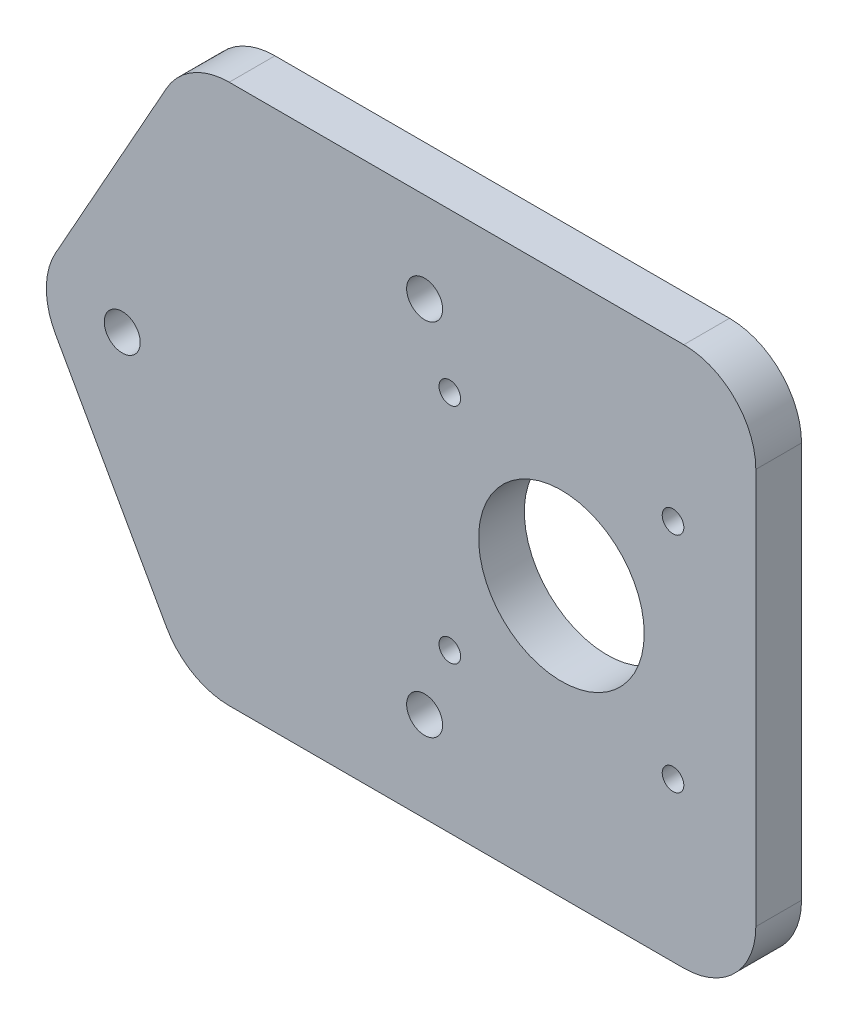
ISO-10303-21;
HEADER;
FILE_DESCRIPTION(('STEP AP214'),'2;1');
FILE_NAME('part.step','',(''),(''),'','','');
FILE_SCHEMA(('AUTOMOTIVE_DESIGN { 1 0 10303 214 1 1 1 1 }'));
ENDSEC;
DATA;
#1=APPLICATION_CONTEXT('core data for automotive mechanical design processes');
#2=APPLICATION_PROTOCOL_DEFINITION('international standard','automotive_design',2000,#1);
#3=PRODUCT_CONTEXT('',#1,'mechanical');
#4=PRODUCT('Part','Part','',(#3));
#5=PRODUCT_RELATED_PRODUCT_CATEGORY('part','',(#4));
#6=PRODUCT_DEFINITION_FORMATION('','',#4);
#7=PRODUCT_DEFINITION_CONTEXT('part definition',#1,'design');
#8=PRODUCT_DEFINITION('design','',#6,#7);
#9=PRODUCT_DEFINITION_SHAPE('','',#8);
#10=(LENGTH_UNIT() NAMED_UNIT(*) SI_UNIT(.MILLI.,.METRE.));
#11=(NAMED_UNIT(*) PLANE_ANGLE_UNIT() SI_UNIT($,.RADIAN.));
#12=(NAMED_UNIT(*) SI_UNIT($,.STERADIAN.) SOLID_ANGLE_UNIT());
#13=UNCERTAINTY_MEASURE_WITH_UNIT(LENGTH_MEASURE(1.E-05),#10,'distance_accuracy_value','');
#14=(GEOMETRIC_REPRESENTATION_CONTEXT(3) GLOBAL_UNCERTAINTY_ASSIGNED_CONTEXT((#13)) GLOBAL_UNIT_ASSIGNED_CONTEXT((#10,
#11,#12)) REPRESENTATION_CONTEXT('',''));
#15=CARTESIAN_POINT('',(0.,0.,0.));
#16=DIRECTION('',(0.,0.,1.));
#17=DIRECTION('',(1.,0.,0.));
#18=AXIS2_PLACEMENT_3D('',#15,#16,#17);
#19=CARTESIAN_POINT('',(0.,75.,6.35));
#20=DIRECTION('',(0.,-1.,0.));
#21=DIRECTION('',(0.,0.,-1.));
#22=AXIS2_PLACEMENT_3D('',#19,#20,#21);
#23=PLANE('',#22);
#24=DIRECTION('',(-1.,0.,0.));
#25=VECTOR('',#24,1.);
#26=CARTESIAN_POINT('',(0.,75.,0.));
#27=LINE('',#26,#25);
#28=CARTESIAN_POINT('',(90.,75.,0.));
#29=VERTEX_POINT('',#28);
#30=CARTESIAN_POINT('',(26.8612390255155,75.,0.));
#31=VERTEX_POINT('',#30);
#32=EDGE_CURVE('E133',#29,#31,#27,.T.);
#33=ORIENTED_EDGE('',*,*,#32,.T.);
#34=DIRECTION('',(0.,0.,1.));
#35=VECTOR('',#34,1.);
#36=CARTESIAN_POINT('',(26.8612390255155,75.,6.35));
#37=LINE('',#36,#35);
#38=CARTESIAN_POINT('',(26.8612390255155,75.,6.35));
#39=VERTEX_POINT('',#38);
#40=EDGE_CURVE('E11',#31,#39,#37,.T.);
#41=ORIENTED_EDGE('',*,*,#40,.T.);
#42=DIRECTION('',(-1.,0.,0.));
#43=VECTOR('',#42,1.);
#44=CARTESIAN_POINT('',(0.,75.,6.35));
#45=LINE('',#44,#43);
#46=CARTESIAN_POINT('',(90.,75.,6.35));
#47=VERTEX_POINT('',#46);
#48=EDGE_CURVE('E136',#47,#39,#45,.T.);
#49=ORIENTED_EDGE('',*,*,#48,.F.);
#50=DIRECTION('',(0.,0.,-1.));
#51=VECTOR('',#50,1.);
#52=CARTESIAN_POINT('',(90.,75.,6.35));
#53=LINE('',#52,#51);
#54=EDGE_CURVE('E123',#47,#29,#53,.T.);
#55=ORIENTED_EDGE('',*,*,#54,.T.);
#56=EDGE_LOOP('',(#33,#41,#49,#55));
#57=FACE_BOUND('',#56,.T.);
#58=ADVANCED_FACE('F39',(#57),#23,.F.);
#59=CARTESIAN_POINT('',(0.,0.,6.35));
#60=DIRECTION('',(0.,0.,-1.));
#61=DIRECTION('',(-1.,0.,0.));
#62=AXIS2_PLACEMENT_3D('',#59,#60,#61);
#63=PLANE('',#62);
#64=CARTESIAN_POINT('',(54.,12.5,6.35));
#65=DIRECTION('',(0.,0.,1.));
#66=DIRECTION('',(1.,0.,0.));
#67=AXIS2_PLACEMENT_3D('',#64,#65,#66);
#68=CIRCLE('',#67,2.5);
#69=CARTESIAN_POINT('',(56.5,12.5,6.35));
#70=VERTEX_POINT('',#69);
#71=EDGE_CURVE('E281',#70,#70,#68,.T.);
#72=ORIENTED_EDGE('',*,*,#71,.F.);
#73=EDGE_LOOP('',(#72));
#74=FACE_BOUND('',#73,.T.);
#75=CARTESIAN_POINT('',(12.,37.5,6.35));
#76=DIRECTION('',(0.,0.,1.));
#77=DIRECTION('',(1.,0.,0.));
#78=AXIS2_PLACEMENT_3D('',#75,#76,#77);
#79=CIRCLE('',#78,2.5);
#80=CARTESIAN_POINT('',(14.5,37.5,6.35));
#81=VERTEX_POINT('',#80);
#82=EDGE_CURVE('E294',#81,#81,#79,.T.);
#83=ORIENTED_EDGE('',*,*,#82,.F.);
#84=EDGE_LOOP('',(#83));
#85=FACE_BOUND('',#84,.T.);
#86=CARTESIAN_POINT('',(54.,62.5,6.35));
#87=DIRECTION('',(0.,0.,1.));
#88=DIRECTION('',(1.,0.,0.));
#89=AXIS2_PLACEMENT_3D('',#86,#87,#88);
#90=CIRCLE('',#89,2.5);
#91=CARTESIAN_POINT('',(56.5,62.5,6.35));
#92=VERTEX_POINT('',#91);
#93=EDGE_CURVE('E286',#92,#92,#90,.T.);
#94=ORIENTED_EDGE('',*,*,#93,.F.);
#95=EDGE_LOOP('',(#94));
#96=FACE_BOUND('',#95,.T.);
#97=CARTESIAN_POINT('',(88.5,53.,6.35));
#98=DIRECTION('',(0.,0.,1.));
#99=DIRECTION('',(1.,0.,0.));
#100=AXIS2_PLACEMENT_3D('',#97,#98,#99);
#101=CIRCLE('',#100,1.5);
#102=CARTESIAN_POINT('',(90.,53.,6.35));
#103=VERTEX_POINT('',#102);
#104=EDGE_CURVE('E274',#103,#103,#101,.T.);
#105=ORIENTED_EDGE('',*,*,#104,.F.);
#106=EDGE_LOOP('',(#105));
#107=FACE_BOUND('',#106,.T.);
#108=CARTESIAN_POINT('',(73.,37.5,6.35));
#109=DIRECTION('',(0.,0.,1.));
#110=DIRECTION('',(1.,0.,0.));
#111=AXIS2_PLACEMENT_3D('',#108,#109,#110);
#112=CIRCLE('',#111,11.5);
#113=CARTESIAN_POINT('',(84.5,37.5,6.35));
#114=VERTEX_POINT('',#113);
#115=EDGE_CURVE('E257',#114,#114,#112,.T.);
#116=ORIENTED_EDGE('',*,*,#115,.F.);
#117=EDGE_LOOP('',(#116));
#118=FACE_BOUND('',#117,.T.);
#119=CARTESIAN_POINT('',(57.5,22.,6.35));
#120=DIRECTION('',(0.,0.,1.));
#121=DIRECTION('',(1.,0.,0.));
#122=AXIS2_PLACEMENT_3D('',#119,#120,#121);
#123=CIRCLE('',#122,1.5);
#124=CARTESIAN_POINT('',(59.,22.,6.35));
#125=VERTEX_POINT('',#124);
#126=EDGE_CURVE('E258',#125,#125,#123,.T.);
#127=ORIENTED_EDGE('',*,*,#126,.F.);
#128=EDGE_LOOP('',(#127));
#129=FACE_BOUND('',#128,.T.);
#130=CARTESIAN_POINT('',(88.5,22.,6.35));
#131=DIRECTION('',(0.,0.,1.));
#132=DIRECTION('',(1.,0.,0.));
#133=AXIS2_PLACEMENT_3D('',#130,#131,#132);
#134=CIRCLE('',#133,1.5);
#135=CARTESIAN_POINT('',(90.,22.,6.35));
#136=VERTEX_POINT('',#135);
#137=EDGE_CURVE('E262',#136,#136,#134,.T.);
#138=ORIENTED_EDGE('',*,*,#137,.F.);
#139=EDGE_LOOP('',(#138));
#140=FACE_BOUND('',#139,.T.);
#141=CARTESIAN_POINT('',(57.5,53.,6.35));
#142=DIRECTION('',(0.,0.,1.));
#143=DIRECTION('',(1.,0.,0.));
#144=AXIS2_PLACEMENT_3D('',#141,#142,#143);
#145=CIRCLE('',#144,1.5);
#146=CARTESIAN_POINT('',(59.,53.,6.35));
#147=VERTEX_POINT('',#146);
#148=EDGE_CURVE('E270',#147,#147,#145,.T.);
#149=ORIENTED_EDGE('',*,*,#148,.F.);
#150=EDGE_LOOP('',(#149));
#151=FACE_BOUND('',#150,.T.);
#152=DIRECTION('',(-0.488603368931843,0.87250601594972,0.));
#153=VECTOR('',#152,1.);
#154=CARTESIAN_POINT('',(15.9866017052375,8.95249695493301,6.35));
#155=LINE('',#154,#153);
#156=CARTESIAN_POINT('',(18.1361788660183,5.11396631068157,6.35));
#157=VERTEX_POINT('',#156);
#158=CARTESIAN_POINT('',(2.73617886601832,32.6139663106816,6.35));
#159=VERTEX_POINT('',#158);
#160=EDGE_CURVE('E249',#157,#159,#155,.T.);
#161=ORIENTED_EDGE('',*,*,#160,.F.);
#162=CARTESIAN_POINT('',(26.8612390255155,10.,6.35));
#163=DIRECTION('',(0.,0.,-1.));
#164=DIRECTION('',(-1.,0.,0.));
#165=AXIS2_PLACEMENT_3D('',#162,#163,#164);
#166=CIRCLE('',#165,10.);
#167=CARTESIAN_POINT('',(26.8612390255155,0.,6.35));
#168=VERTEX_POINT('',#167);
#169=EDGE_CURVE('E216',#157,#168,#166,.F.);
#170=ORIENTED_EDGE('',*,*,#169,.T.);
#171=DIRECTION('',(1.,0.,0.));
#172=VECTOR('',#171,1.);
#173=CARTESIAN_POINT('',(0.,0.,6.35));
#174=LINE('',#173,#172);
#175=CARTESIAN_POINT('',(90.,0.,6.35));
#176=VERTEX_POINT('',#175);
#177=EDGE_CURVE('E143',#168,#176,#174,.T.);
#178=ORIENTED_EDGE('',*,*,#177,.T.);
#179=CARTESIAN_POINT('',(90.,10.,6.35));
#180=DIRECTION('',(0.,0.,-1.));
#181=DIRECTION('',(-1.,0.,0.));
#182=AXIS2_PLACEMENT_3D('',#179,#180,#181);
#183=CIRCLE('',#182,10.);
#184=CARTESIAN_POINT('',(100.,10.,6.35));
#185=VERTEX_POINT('',#184);
#186=EDGE_CURVE('E190',#176,#185,#183,.F.);
#187=ORIENTED_EDGE('',*,*,#186,.T.);
#188=DIRECTION('',(0.,1.,0.));
#189=VECTOR('',#188,1.);
#190=CARTESIAN_POINT('',(100.,0.,6.35));
#191=LINE('',#190,#189);
#192=CARTESIAN_POINT('',(100.,65.,6.35));
#193=VERTEX_POINT('',#192);
#194=EDGE_CURVE('E148',#185,#193,#191,.T.);
#195=ORIENTED_EDGE('',*,*,#194,.T.);
#196=CARTESIAN_POINT('',(90.,65.,6.35));
#197=DIRECTION('',(0.,0.,-1.));
#198=DIRECTION('',(-1.,0.,0.));
#199=AXIS2_PLACEMENT_3D('',#196,#197,#198);
#200=CIRCLE('',#199,10.);
#201=EDGE_CURVE('E138',#193,#47,#200,.F.);
#202=ORIENTED_EDGE('',*,*,#201,.T.);
#203=ORIENTED_EDGE('',*,*,#48,.T.);
#204=CARTESIAN_POINT('',(26.8612390255155,65.,6.35));
#205=DIRECTION('',(0.,0.,-1.));
#206=DIRECTION('',(-1.,0.,0.));
#207=AXIS2_PLACEMENT_3D('',#204,#205,#206);
#208=CIRCLE('',#207,10.);
#209=CARTESIAN_POINT('',(18.1361788660183,69.8860336893184,6.35));
#210=VERTEX_POINT('',#209);
#211=EDGE_CURVE('E210',#39,#210,#208,.F.);
#212=ORIENTED_EDGE('',*,*,#211,.T.);
#213=DIRECTION('',(-0.488603368931843,-0.87250601594972,0.));
#214=VECTOR('',#213,1.);
#215=CARTESIAN_POINT('',(15.9866017052375,66.047503045067,6.35));
#216=LINE('',#215,#214);
#217=CARTESIAN_POINT('',(2.73617886601831,42.3860336893184,6.35));
#218=VERTEX_POINT('',#217);
#219=EDGE_CURVE('E238',#210,#218,#216,.T.);
#220=ORIENTED_EDGE('',*,*,#219,.T.);
#221=CARTESIAN_POINT('',(11.4612390255155,37.5,6.35));
#222=DIRECTION('',(0.,0.,-1.));
#223=DIRECTION('',(-1.,0.,0.));
#224=AXIS2_PLACEMENT_3D('',#221,#222,#223);
#225=CIRCLE('',#224,10.);
#226=EDGE_CURVE('E213',#218,#159,#225,.F.);
#227=ORIENTED_EDGE('',*,*,#226,.T.);
#228=EDGE_LOOP('',(#161,#170,#178,#187,#195,#202,#203,#212,#220,#227));
#229=FACE_BOUND('',#228,.T.);
#230=ADVANCED_FACE('F244',(#74,#85,#96,#107,#118,#129,#140,#151,#229),#63,.F.);
#231=CARTESIAN_POINT('',(0.,0.,0.));
#232=DIRECTION('',(0.,0.,-1.));
#233=DIRECTION('',(-1.,0.,0.));
#234=AXIS2_PLACEMENT_3D('',#231,#232,#233);
#235=PLANE('',#234);
#236=CARTESIAN_POINT('',(88.5,22.,0.));
#237=DIRECTION('',(0.,0.,-1.));
#238=DIRECTION('',(-1.,0.,0.));
#239=AXIS2_PLACEMENT_3D('',#236,#237,#238);
#240=CIRCLE('',#239,3.00000000000004);
#241=CARTESIAN_POINT('',(85.4999999999999,22.,0.));
#242=VERTEX_POINT('',#241);
#243=EDGE_CURVE('E166',#242,#242,#240,.F.);
#244=ORIENTED_EDGE('',*,*,#243,.T.);
#245=EDGE_LOOP('',(#244));
#246=FACE_BOUND('',#245,.T.);
#247=CARTESIAN_POINT('',(57.5,22.,0.));
#248=DIRECTION('',(0.,0.,-1.));
#249=DIRECTION('',(-1.,0.,0.));
#250=AXIS2_PLACEMENT_3D('',#247,#248,#249);
#251=CIRCLE('',#250,2.99999999999999);
#252=CARTESIAN_POINT('',(54.5,22.,0.));
#253=VERTEX_POINT('',#252);
#254=EDGE_CURVE('E162',#253,#253,#251,.F.);
#255=ORIENTED_EDGE('',*,*,#254,.T.);
#256=EDGE_LOOP('',(#255));
#257=FACE_BOUND('',#256,.T.);
#258=CARTESIAN_POINT('',(88.5,53.,0.));
#259=DIRECTION('',(0.,0.,-1.));
#260=DIRECTION('',(-1.,0.,0.));
#261=AXIS2_PLACEMENT_3D('',#258,#259,#260);
#262=CIRCLE('',#261,3.00000000000004);
#263=CARTESIAN_POINT('',(85.4999999999999,53.,0.));
#264=VERTEX_POINT('',#263);
#265=EDGE_CURVE('E158',#264,#264,#262,.F.);
#266=ORIENTED_EDGE('',*,*,#265,.T.);
#267=EDGE_LOOP('',(#266));
#268=FACE_BOUND('',#267,.T.);
#269=CARTESIAN_POINT('',(57.5,53.,0.));
#270=DIRECTION('',(0.,0.,-1.));
#271=DIRECTION('',(-1.,0.,0.));
#272=AXIS2_PLACEMENT_3D('',#269,#270,#271);
#273=CIRCLE('',#272,2.99999999999999);
#274=CARTESIAN_POINT('',(54.5,53.,0.));
#275=VERTEX_POINT('',#274);
#276=EDGE_CURVE('E154',#275,#275,#273,.F.);
#277=ORIENTED_EDGE('',*,*,#276,.T.);
#278=EDGE_LOOP('',(#277));
#279=FACE_BOUND('',#278,.T.);
#280=CARTESIAN_POINT('',(73.,37.5,0.));
#281=DIRECTION('',(0.,0.,1.));
#282=DIRECTION('',(1.,0.,0.));
#283=AXIS2_PLACEMENT_3D('',#280,#281,#282);
#284=CIRCLE('',#283,11.5);
#285=CARTESIAN_POINT('',(84.5,37.5,0.));
#286=VERTEX_POINT('',#285);
#287=EDGE_CURVE('E263',#286,#286,#284,.T.);
#288=ORIENTED_EDGE('',*,*,#287,.T.);
#289=EDGE_LOOP('',(#288));
#290=FACE_BOUND('',#289,.T.);
#291=CARTESIAN_POINT('',(54.,62.5,0.));
#292=DIRECTION('',(0.,0.,1.));
#293=DIRECTION('',(1.,0.,0.));
#294=AXIS2_PLACEMENT_3D('',#291,#292,#293);
#295=CIRCLE('',#294,2.5);
#296=CARTESIAN_POINT('',(56.5,62.5,0.));
#297=VERTEX_POINT('',#296);
#298=EDGE_CURVE('E282',#297,#297,#295,.T.);
#299=ORIENTED_EDGE('',*,*,#298,.T.);
#300=EDGE_LOOP('',(#299));
#301=FACE_BOUND('',#300,.T.);
#302=CARTESIAN_POINT('',(12.,37.5,0.));
#303=DIRECTION('',(0.,0.,1.));
#304=DIRECTION('',(1.,0.,0.));
#305=AXIS2_PLACEMENT_3D('',#302,#303,#304);
#306=CIRCLE('',#305,2.5);
#307=CARTESIAN_POINT('',(14.5,37.5,0.));
#308=VERTEX_POINT('',#307);
#309=EDGE_CURVE('E290',#308,#308,#306,.T.);
#310=ORIENTED_EDGE('',*,*,#309,.T.);
#311=EDGE_LOOP('',(#310));
#312=FACE_BOUND('',#311,.T.);
#313=CARTESIAN_POINT('',(54.,12.5,0.));
#314=DIRECTION('',(0.,0.,1.));
#315=DIRECTION('',(1.,0.,0.));
#316=AXIS2_PLACEMENT_3D('',#313,#314,#315);
#317=CIRCLE('',#316,2.5);
#318=CARTESIAN_POINT('',(56.5,12.5,0.));
#319=VERTEX_POINT('',#318);
#320=EDGE_CURVE('E298',#319,#319,#317,.T.);
#321=ORIENTED_EDGE('',*,*,#320,.T.);
#322=EDGE_LOOP('',(#321));
#323=FACE_BOUND('',#322,.T.);
#324=DIRECTION('',(1.,0.,0.));
#325=VECTOR('',#324,1.);
#326=CARTESIAN_POINT('',(0.,0.,0.));
#327=LINE('',#326,#325);
#328=CARTESIAN_POINT('',(26.8612390255155,0.,0.));
#329=VERTEX_POINT('',#328);
#330=CARTESIAN_POINT('',(90.,0.,0.));
#331=VERTEX_POINT('',#330);
#332=EDGE_CURVE('E150',#329,#331,#327,.T.);
#333=ORIENTED_EDGE('',*,*,#332,.F.);
#334=CARTESIAN_POINT('',(26.8612390255155,10.,0.));
#335=DIRECTION('',(0.,0.,-1.));
#336=DIRECTION('',(-1.,0.,0.));
#337=AXIS2_PLACEMENT_3D('',#334,#335,#336);
#338=CIRCLE('',#337,10.);
#339=CARTESIAN_POINT('',(18.1361788660183,5.11396631068157,0.));
#340=VERTEX_POINT('',#339);
#341=EDGE_CURVE('E226',#329,#340,#338,.T.);
#342=ORIENTED_EDGE('',*,*,#341,.T.);
#343=DIRECTION('',(-0.488603368931843,0.87250601594972,0.));
#344=VECTOR('',#343,1.);
#345=CARTESIAN_POINT('',(15.9866017052375,8.95249695493301,0.));
#346=LINE('',#345,#344);
#347=CARTESIAN_POINT('',(2.73617886601832,32.6139663106816,0.));
#348=VERTEX_POINT('',#347);
#349=EDGE_CURVE('E254',#340,#348,#346,.T.);
#350=ORIENTED_EDGE('',*,*,#349,.T.);
#351=CARTESIAN_POINT('',(11.4612390255155,37.5,0.));
#352=DIRECTION('',(0.,0.,-1.));
#353=DIRECTION('',(-1.,0.,0.));
#354=AXIS2_PLACEMENT_3D('',#351,#352,#353);
#355=CIRCLE('',#354,10.);
#356=CARTESIAN_POINT('',(2.73617886601832,42.3860336893184,0.));
#357=VERTEX_POINT('',#356);
#358=EDGE_CURVE('E61',#348,#357,#355,.T.);
#359=ORIENTED_EDGE('',*,*,#358,.T.);
#360=DIRECTION('',(-0.488603368931843,-0.87250601594972,0.));
#361=VECTOR('',#360,1.);
#362=CARTESIAN_POINT('',(15.9866017052375,66.047503045067,0.));
#363=LINE('',#362,#361);
#364=CARTESIAN_POINT('',(18.1361788660183,69.8860336893184,0.));
#365=VERTEX_POINT('',#364);
#366=EDGE_CURVE('E240',#365,#357,#363,.T.);
#367=ORIENTED_EDGE('',*,*,#366,.F.);
#368=CARTESIAN_POINT('',(26.8612390255155,65.,0.));
#369=DIRECTION('',(0.,0.,-1.));
#370=DIRECTION('',(-1.,0.,0.));
#371=AXIS2_PLACEMENT_3D('',#368,#369,#370);
#372=CIRCLE('',#371,10.);
#373=EDGE_CURVE('E55',#365,#31,#372,.T.);
#374=ORIENTED_EDGE('',*,*,#373,.T.);
#375=ORIENTED_EDGE('',*,*,#32,.F.);
#376=CARTESIAN_POINT('',(90.,65.,0.));
#377=DIRECTION('',(0.,0.,-1.));
#378=DIRECTION('',(-1.,0.,0.));
#379=AXIS2_PLACEMENT_3D('',#376,#377,#378);
#380=CIRCLE('',#379,10.);
#381=CARTESIAN_POINT('',(100.,65.,0.));
#382=VERTEX_POINT('',#381);
#383=EDGE_CURVE('E119',#29,#382,#380,.T.);
#384=ORIENTED_EDGE('',*,*,#383,.T.);
#385=DIRECTION('',(0.,1.,0.));
#386=VECTOR('',#385,1.);
#387=CARTESIAN_POINT('',(100.,0.,0.));
#388=LINE('',#387,#386);
#389=CARTESIAN_POINT('',(100.,10.,0.));
#390=VERTEX_POINT('',#389);
#391=EDGE_CURVE('E144',#390,#382,#388,.T.);
#392=ORIENTED_EDGE('',*,*,#391,.F.);
#393=CARTESIAN_POINT('',(90.,10.,0.));
#394=DIRECTION('',(0.,0.,-1.));
#395=DIRECTION('',(-1.,0.,0.));
#396=AXIS2_PLACEMENT_3D('',#393,#394,#395);
#397=CIRCLE('',#396,10.);
#398=EDGE_CURVE('E128',#390,#331,#397,.T.);
#399=ORIENTED_EDGE('',*,*,#398,.T.);
#400=EDGE_LOOP('',(#333,#342,#350,#359,#367,#374,#375,#384,#392,#399));
#401=FACE_BOUND('',#400,.T.);
#402=ADVANCED_FACE('F141',(#246,#257,#268,#279,#290,#301,#312,#323,#401),#235,.T.);
#403=CARTESIAN_POINT('',(0.,0.,6.35));
#404=DIRECTION('',(0.,1.,0.));
#405=DIRECTION('',(0.,0.,1.));
#406=AXIS2_PLACEMENT_3D('',#403,#404,#405);
#407=PLANE('',#406);
#408=ORIENTED_EDGE('',*,*,#177,.F.);
#409=DIRECTION('',(0.,0.,1.));
#410=VECTOR('',#409,1.);
#411=CARTESIAN_POINT('',(26.8612390255155,0.,6.35));
#412=LINE('',#411,#410);
#413=EDGE_CURVE('E219',#168,#329,#412,.F.);
#414=ORIENTED_EDGE('',*,*,#413,.T.);
#415=ORIENTED_EDGE('',*,*,#332,.T.);
#416=DIRECTION('',(0.,0.,-1.));
#417=VECTOR('',#416,1.);
#418=CARTESIAN_POINT('',(90.,0.,6.35));
#419=LINE('',#418,#417);
#420=EDGE_CURVE('E199',#331,#176,#419,.F.);
#421=ORIENTED_EDGE('',*,*,#420,.T.);
#422=EDGE_LOOP('',(#408,#414,#415,#421));
#423=FACE_BOUND('',#422,.T.);
#424=ADVANCED_FACE('F312',(#423),#407,.F.);
#425=CARTESIAN_POINT('',(100.,0.,6.35));
#426=DIRECTION('',(-1.,0.,0.));
#427=DIRECTION('',(0.,0.,1.));
#428=AXIS2_PLACEMENT_3D('',#425,#426,#427);
#429=PLANE('',#428);
#430=ORIENTED_EDGE('',*,*,#194,.F.);
#431=DIRECTION('',(0.,0.,-1.));
#432=VECTOR('',#431,1.);
#433=CARTESIAN_POINT('',(100.,10.,6.35));
#434=LINE('',#433,#432);
#435=EDGE_CURVE('E195',#185,#390,#434,.T.);
#436=ORIENTED_EDGE('',*,*,#435,.T.);
#437=ORIENTED_EDGE('',*,*,#391,.T.);
#438=DIRECTION('',(0.,0.,-1.));
#439=VECTOR('',#438,1.);
#440=CARTESIAN_POINT('',(100.,65.,6.35));
#441=LINE('',#440,#439);
#442=EDGE_CURVE('E124',#382,#193,#441,.F.);
#443=ORIENTED_EDGE('',*,*,#442,.T.);
#444=EDGE_LOOP('',(#430,#436,#437,#443));
#445=FACE_BOUND('',#444,.T.);
#446=ADVANCED_FACE('F322',(#445),#429,.F.);
#447=CARTESIAN_POINT('',(54.,12.5,0.));
#448=DIRECTION('',(0.,0.,1.));
#449=DIRECTION('',(1.,0.,0.));
#450=AXIS2_PLACEMENT_3D('',#447,#448,#449);
#451=CYLINDRICAL_SURFACE('',#450,2.5);
#452=ORIENTED_EDGE('',*,*,#320,.F.);
#453=EDGE_LOOP('',(#452));
#454=FACE_BOUND('',#453,.T.);
#455=ORIENTED_EDGE('',*,*,#71,.T.);
#456=EDGE_LOOP('',(#455));
#457=FACE_BOUND('',#456,.T.);
#458=ADVANCED_FACE('F324',(#454,#457),#451,.F.);
#459=CARTESIAN_POINT('',(12.,37.5,0.));
#460=DIRECTION('',(0.,0.,1.));
#461=DIRECTION('',(1.,0.,0.));
#462=AXIS2_PLACEMENT_3D('',#459,#460,#461);
#463=CYLINDRICAL_SURFACE('',#462,2.5);
#464=ORIENTED_EDGE('',*,*,#309,.F.);
#465=EDGE_LOOP('',(#464));
#466=FACE_BOUND('',#465,.T.);
#467=ORIENTED_EDGE('',*,*,#82,.T.);
#468=EDGE_LOOP('',(#467));
#469=FACE_BOUND('',#468,.T.);
#470=ADVANCED_FACE('F330',(#466,#469),#463,.F.);
#471=CARTESIAN_POINT('',(54.,62.5,0.));
#472=DIRECTION('',(0.,0.,1.));
#473=DIRECTION('',(1.,0.,0.));
#474=AXIS2_PLACEMENT_3D('',#471,#472,#473);
#475=CYLINDRICAL_SURFACE('',#474,2.5);
#476=ORIENTED_EDGE('',*,*,#298,.F.);
#477=EDGE_LOOP('',(#476));
#478=FACE_BOUND('',#477,.T.);
#479=ORIENTED_EDGE('',*,*,#93,.T.);
#480=EDGE_LOOP('',(#479));
#481=FACE_BOUND('',#480,.T.);
#482=ADVANCED_FACE('F347',(#478,#481),#475,.F.);
#483=CARTESIAN_POINT('',(88.5,53.,0.));
#484=DIRECTION('',(0.,0.,1.));
#485=DIRECTION('',(1.,0.,0.));
#486=AXIS2_PLACEMENT_3D('',#483,#484,#485);
#487=CYLINDRICAL_SURFACE('',#486,1.5);
#488=CARTESIAN_POINT('',(88.5,53.,1.50000000000002));
#489=DIRECTION('',(0.,0.,-1.));
#490=DIRECTION('',(-1.,0.,0.));
#491=AXIS2_PLACEMENT_3D('',#488,#489,#490);
#492=CIRCLE('',#491,1.5);
#493=CARTESIAN_POINT('',(87.,53.,1.50000000000002));
#494=VERTEX_POINT('',#493);
#495=EDGE_CURVE('E178',#494,#494,#492,.T.);
#496=ORIENTED_EDGE('',*,*,#495,.T.);
#497=EDGE_LOOP('',(#496));
#498=FACE_BOUND('',#497,.T.);
#499=ORIENTED_EDGE('',*,*,#104,.T.);
#500=EDGE_LOOP('',(#499));
#501=FACE_BOUND('',#500,.T.);
#502=ADVANCED_FACE('F351',(#498,#501),#487,.F.);
#503=CARTESIAN_POINT('',(73.,37.5,0.));
#504=DIRECTION('',(0.,0.,1.));
#505=DIRECTION('',(1.,0.,0.));
#506=AXIS2_PLACEMENT_3D('',#503,#504,#505);
#507=CYLINDRICAL_SURFACE('',#506,11.5);
#508=ORIENTED_EDGE('',*,*,#287,.F.);
#509=EDGE_LOOP('',(#508));
#510=FACE_BOUND('',#509,.T.);
#511=ORIENTED_EDGE('',*,*,#115,.T.);
#512=EDGE_LOOP('',(#511));
#513=FACE_BOUND('',#512,.T.);
#514=ADVANCED_FACE('F355',(#510,#513),#507,.F.);
#515=CARTESIAN_POINT('',(57.5,22.,0.));
#516=DIRECTION('',(0.,0.,1.));
#517=DIRECTION('',(1.,0.,0.));
#518=AXIS2_PLACEMENT_3D('',#515,#516,#517);
#519=CYLINDRICAL_SURFACE('',#518,1.5);
#520=CARTESIAN_POINT('',(57.5,22.,1.49999999999999));
#521=DIRECTION('',(0.,0.,-1.));
#522=DIRECTION('',(-1.,0.,0.));
#523=AXIS2_PLACEMENT_3D('',#520,#521,#522);
#524=CIRCLE('',#523,1.5);
#525=CARTESIAN_POINT('',(56.,22.,1.49999999999999));
#526=VERTEX_POINT('',#525);
#527=EDGE_CURVE('E174',#526,#526,#524,.T.);
#528=ORIENTED_EDGE('',*,*,#527,.T.);
#529=EDGE_LOOP('',(#528));
#530=FACE_BOUND('',#529,.T.);
#531=ORIENTED_EDGE('',*,*,#126,.T.);
#532=EDGE_LOOP('',(#531));
#533=FACE_BOUND('',#532,.T.);
#534=ADVANCED_FACE('F361',(#530,#533),#519,.F.);
#535=CARTESIAN_POINT('',(88.5,22.,0.));
#536=DIRECTION('',(0.,0.,1.));
#537=DIRECTION('',(1.,0.,0.));
#538=AXIS2_PLACEMENT_3D('',#535,#536,#537);
#539=CYLINDRICAL_SURFACE('',#538,1.5);
#540=CARTESIAN_POINT('',(88.5,22.,1.50000000000002));
#541=DIRECTION('',(0.,0.,-1.));
#542=DIRECTION('',(-1.,0.,0.));
#543=AXIS2_PLACEMENT_3D('',#540,#541,#542);
#544=CIRCLE('',#543,1.5);
#545=CARTESIAN_POINT('',(87.,22.,1.50000000000002));
#546=VERTEX_POINT('',#545);
#547=EDGE_CURVE('E170',#546,#546,#544,.T.);
#548=ORIENTED_EDGE('',*,*,#547,.T.);
#549=EDGE_LOOP('',(#548));
#550=FACE_BOUND('',#549,.T.);
#551=ORIENTED_EDGE('',*,*,#137,.T.);
#552=EDGE_LOOP('',(#551));
#553=FACE_BOUND('',#552,.T.);
#554=ADVANCED_FACE('F357',(#550,#553),#539,.F.);
#555=CARTESIAN_POINT('',(57.5,53.,0.));
#556=DIRECTION('',(0.,0.,1.));
#557=DIRECTION('',(1.,0.,0.));
#558=AXIS2_PLACEMENT_3D('',#555,#556,#557);
#559=CYLINDRICAL_SURFACE('',#558,1.5);
#560=CARTESIAN_POINT('',(57.5,53.,1.49999999999999));
#561=DIRECTION('',(0.,0.,-1.));
#562=DIRECTION('',(-1.,0.,0.));
#563=AXIS2_PLACEMENT_3D('',#560,#561,#562);
#564=CIRCLE('',#563,1.5);
#565=CARTESIAN_POINT('',(56.,53.,1.49999999999999));
#566=VERTEX_POINT('',#565);
#567=EDGE_CURVE('E129',#566,#566,#564,.T.);
#568=ORIENTED_EDGE('',*,*,#567,.T.);
#569=EDGE_LOOP('',(#568));
#570=FACE_BOUND('',#569,.T.);
#571=ORIENTED_EDGE('',*,*,#148,.T.);
#572=EDGE_LOOP('',(#571));
#573=FACE_BOUND('',#572,.T.);
#574=ADVANCED_FACE('F360',(#570,#573),#559,.F.);
#575=CARTESIAN_POINT('',(88.5,22.,0.));
#576=DIRECTION('',(0.,0.,-1.));
#577=DIRECTION('',(-1.,0.,0.));
#578=AXIS2_PLACEMENT_3D('',#575,#576,#577);
#579=CONICAL_SURFACE('',#578,3.00000000000004,0.785398163397456);
#580=ORIENTED_EDGE('',*,*,#547,.F.);
#581=EDGE_LOOP('',(#580));
#582=FACE_BOUND('',#581,.T.);
#583=ORIENTED_EDGE('',*,*,#243,.F.);
#584=EDGE_LOOP('',(#583));
#585=FACE_BOUND('',#584,.T.);
#586=ADVANCED_FACE('F365',(#582,#585),#579,.F.);
#587=CARTESIAN_POINT('',(57.5,22.,0.));
#588=DIRECTION('',(0.,0.,-1.));
#589=DIRECTION('',(-1.,0.,0.));
#590=AXIS2_PLACEMENT_3D('',#587,#588,#589);
#591=CONICAL_SURFACE('',#590,2.99999999999999,0.785398163397447);
#592=ORIENTED_EDGE('',*,*,#527,.F.);
#593=EDGE_LOOP('',(#592));
#594=FACE_BOUND('',#593,.T.);
#595=ORIENTED_EDGE('',*,*,#254,.F.);
#596=EDGE_LOOP('',(#595));
#597=FACE_BOUND('',#596,.T.);
#598=ADVANCED_FACE('F400',(#594,#597),#591,.F.);
#599=CARTESIAN_POINT('',(88.5,53.,0.));
#600=DIRECTION('',(0.,0.,-1.));
#601=DIRECTION('',(-1.,0.,0.));
#602=AXIS2_PLACEMENT_3D('',#599,#600,#601);
#603=CONICAL_SURFACE('',#602,3.00000000000004,0.785398163397456);
#604=ORIENTED_EDGE('',*,*,#495,.F.);
#605=EDGE_LOOP('',(#604));
#606=FACE_BOUND('',#605,.T.);
#607=ORIENTED_EDGE('',*,*,#265,.F.);
#608=EDGE_LOOP('',(#607));
#609=FACE_BOUND('',#608,.T.);
#610=ADVANCED_FACE('F396',(#606,#609),#603,.F.);
#611=CARTESIAN_POINT('',(57.5,53.,0.));
#612=DIRECTION('',(0.,0.,-1.));
#613=DIRECTION('',(-1.,0.,0.));
#614=AXIS2_PLACEMENT_3D('',#611,#612,#613);
#615=CONICAL_SURFACE('',#614,2.99999999999999,0.785398163397447);
#616=ORIENTED_EDGE('',*,*,#567,.F.);
#617=EDGE_LOOP('',(#616));
#618=FACE_BOUND('',#617,.T.);
#619=ORIENTED_EDGE('',*,*,#276,.F.);
#620=EDGE_LOOP('',(#619));
#621=FACE_BOUND('',#620,.T.);
#622=ADVANCED_FACE('F393',(#618,#621),#615,.F.);
#623=CARTESIAN_POINT('',(90.,10.,6.35));
#624=DIRECTION('',(0.,0.,-1.));
#625=DIRECTION('',(-1.,0.,0.));
#626=AXIS2_PLACEMENT_3D('',#623,#624,#625);
#627=CYLINDRICAL_SURFACE('',#626,10.);
#628=ORIENTED_EDGE('',*,*,#186,.F.);
#629=ORIENTED_EDGE('',*,*,#420,.F.);
#630=ORIENTED_EDGE('',*,*,#398,.F.);
#631=ORIENTED_EDGE('',*,*,#435,.F.);
#632=EDGE_LOOP('',(#628,#629,#630,#631));
#633=FACE_BOUND('',#632,.T.);
#634=ADVANCED_FACE('F319',(#633),#627,.T.);
#635=CARTESIAN_POINT('',(90.,65.,6.35));
#636=DIRECTION('',(0.,0.,-1.));
#637=DIRECTION('',(-1.,0.,0.));
#638=AXIS2_PLACEMENT_3D('',#635,#636,#637);
#639=CYLINDRICAL_SURFACE('',#638,10.);
#640=ORIENTED_EDGE('',*,*,#201,.F.);
#641=ORIENTED_EDGE('',*,*,#442,.F.);
#642=ORIENTED_EDGE('',*,*,#383,.F.);
#643=ORIENTED_EDGE('',*,*,#54,.F.);
#644=EDGE_LOOP('',(#640,#641,#642,#643));
#645=FACE_BOUND('',#644,.T.);
#646=ADVANCED_FACE('F122',(#645),#639,.T.);
#647=CARTESIAN_POINT('',(15.9866017052375,8.95249695493301,-42.9796463456832));
#648=DIRECTION('',(0.87250601594972,0.488603368931843,0.));
#649=DIRECTION('',(-0.488603368931843,0.87250601594972,0.));
#650=AXIS2_PLACEMENT_3D('',#647,#648,#649);
#651=PLANE('',#650);
#652=ORIENTED_EDGE('',*,*,#349,.F.);
#653=DIRECTION('',(0.,0.,1.));
#654=VECTOR('',#653,1.);
#655=CARTESIAN_POINT('',(18.1361788660183,5.11396631068157,-42.9796463456832));
#656=LINE('',#655,#654);
#657=EDGE_CURVE('E206',#340,#157,#656,.T.);
#658=ORIENTED_EDGE('',*,*,#657,.T.);
#659=ORIENTED_EDGE('',*,*,#160,.T.);
#660=DIRECTION('',(0.,0.,1.));
#661=VECTOR('',#660,1.);
#662=CARTESIAN_POINT('',(2.73617886601832,32.6139663106816,0.));
#663=LINE('',#662,#661);
#664=EDGE_CURVE('E203',#159,#348,#663,.F.);
#665=ORIENTED_EDGE('',*,*,#664,.T.);
#666=EDGE_LOOP('',(#652,#658,#659,#665));
#667=FACE_BOUND('',#666,.T.);
#668=ADVANCED_FACE('F373',(#667),#651,.F.);
#669=CARTESIAN_POINT('',(15.9866017052375,66.047503045067,-42.9796463456832));
#670=DIRECTION('',(-0.87250601594972,0.488603368931843,0.));
#671=DIRECTION('',(-0.488603368931843,-0.87250601594972,0.));
#672=AXIS2_PLACEMENT_3D('',#669,#670,#671);
#673=PLANE('',#672);
#674=ORIENTED_EDGE('',*,*,#366,.T.);
#675=DIRECTION('',(0.,0.,1.));
#676=VECTOR('',#675,1.);
#677=CARTESIAN_POINT('',(2.73617886601832,42.3860336893184,6.35));
#678=LINE('',#677,#676);
#679=EDGE_CURVE('E48',#357,#218,#678,.T.);
#680=ORIENTED_EDGE('',*,*,#679,.T.);
#681=ORIENTED_EDGE('',*,*,#219,.F.);
#682=DIRECTION('',(0.,0.,1.));
#683=VECTOR('',#682,1.);
#684=CARTESIAN_POINT('',(18.1361788660183,69.8860336893184,0.));
#685=LINE('',#684,#683);
#686=EDGE_CURVE('E229',#210,#365,#685,.F.);
#687=ORIENTED_EDGE('',*,*,#686,.T.);
#688=EDGE_LOOP('',(#674,#680,#681,#687));
#689=FACE_BOUND('',#688,.T.);
#690=ADVANCED_FACE('F237',(#689),#673,.T.);
#691=CARTESIAN_POINT('',(26.8612390255155,10.,-42.9796463456832));
#692=DIRECTION('',(0.,0.,1.));
#693=DIRECTION('',(1.,0.,0.));
#694=AXIS2_PLACEMENT_3D('',#691,#692,#693);
#695=CYLINDRICAL_SURFACE('',#694,10.);
#696=ORIENTED_EDGE('',*,*,#341,.F.);
#697=ORIENTED_EDGE('',*,*,#413,.F.);
#698=ORIENTED_EDGE('',*,*,#169,.F.);
#699=ORIENTED_EDGE('',*,*,#657,.F.);
#700=EDGE_LOOP('',(#696,#697,#698,#699));
#701=FACE_BOUND('',#700,.T.);
#702=ADVANCED_FACE('F378',(#701),#695,.T.);
#703=CARTESIAN_POINT('',(11.4612390255155,37.5,-42.9796463456832));
#704=DIRECTION('',(0.,0.,-1.));
#705=DIRECTION('',(-1.,0.,0.));
#706=AXIS2_PLACEMENT_3D('',#703,#704,#705);
#707=CYLINDRICAL_SURFACE('',#706,10.);
#708=ORIENTED_EDGE('',*,*,#358,.F.);
#709=ORIENTED_EDGE('',*,*,#664,.F.);
#710=ORIENTED_EDGE('',*,*,#226,.F.);
#711=ORIENTED_EDGE('',*,*,#679,.F.);
#712=EDGE_LOOP('',(#708,#709,#710,#711));
#713=FACE_BOUND('',#712,.T.);
#714=ADVANCED_FACE('F382',(#713),#707,.T.);
#715=CARTESIAN_POINT('',(26.8612390255155,65.,6.35));
#716=DIRECTION('',(0.,0.,-1.));
#717=DIRECTION('',(-1.,0.,0.));
#718=AXIS2_PLACEMENT_3D('',#715,#716,#717);
#719=CYLINDRICAL_SURFACE('',#718,10.);
#720=ORIENTED_EDGE('',*,*,#373,.F.);
#721=ORIENTED_EDGE('',*,*,#686,.F.);
#722=ORIENTED_EDGE('',*,*,#211,.F.);
#723=ORIENTED_EDGE('',*,*,#40,.F.);
#724=EDGE_LOOP('',(#720,#721,#722,#723));
#725=FACE_BOUND('',#724,.T.);
#726=ADVANCED_FACE('F41',(#725),#719,.T.);
#727=CLOSED_SHELL('',(#58,#230,#402,#424,#446,#458,#470,#482,#502,#514,#534,#554,#574,#586,#598,
#610,#622,#634,#646,#668,#690,#702,#714,#726));
#728=MANIFOLD_SOLID_BREP('B2',#727);
#729=ADVANCED_BREP_SHAPE_REPRESENTATION('',(#18,#728),#14);
#730=SHAPE_DEFINITION_REPRESENTATION(#9,#729);
ENDSEC;
END-ISO-10303-21;
